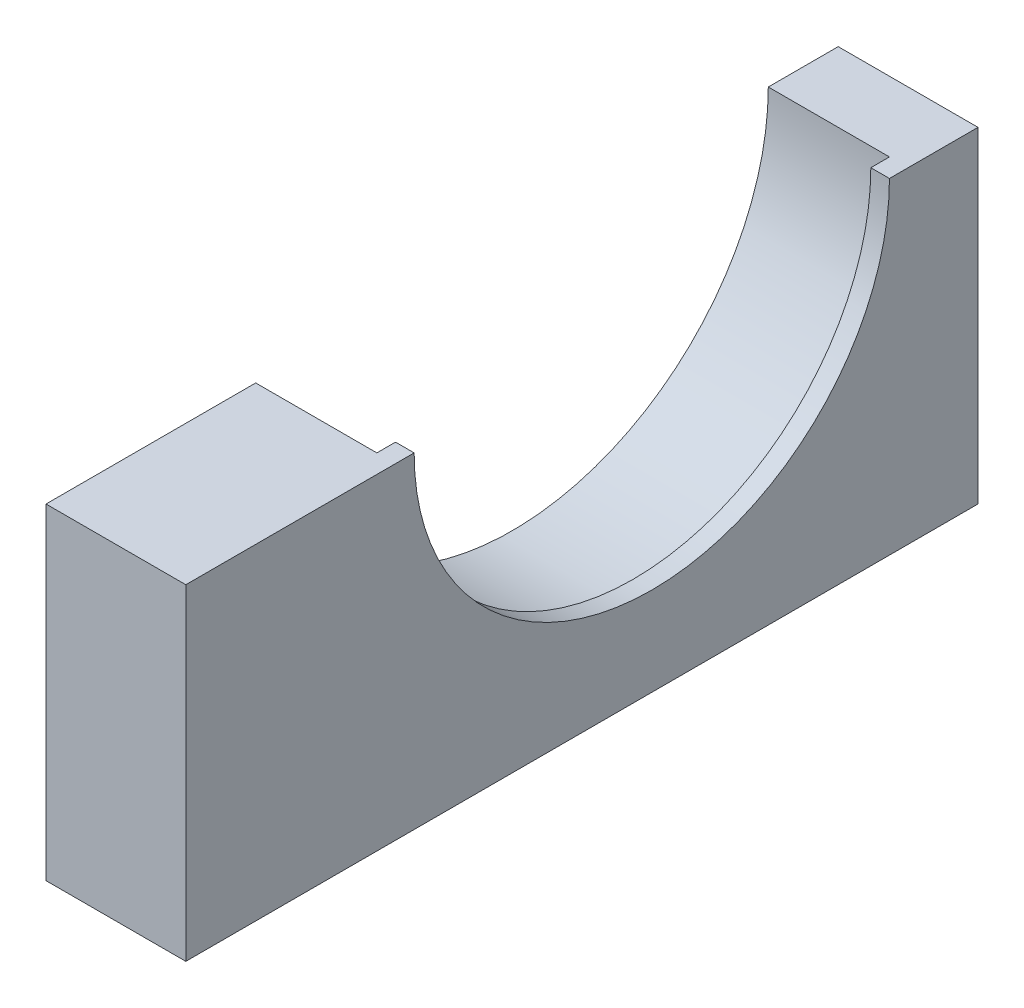
ISO-10303-21;
HEADER;
FILE_DESCRIPTION(('STEP AP214'),'2;1');
FILE_NAME('part.step','',(''),(''),'','','');
FILE_SCHEMA(('AUTOMOTIVE_DESIGN { 1 0 10303 214 1 1 1 1 }'));
ENDSEC;
DATA;
#1=APPLICATION_CONTEXT('core data for automotive mechanical design processes');
#2=APPLICATION_PROTOCOL_DEFINITION('international standard','automotive_design',2000,#1);
#3=PRODUCT_CONTEXT('',#1,'mechanical');
#4=PRODUCT('Part','Part','',(#3));
#5=PRODUCT_RELATED_PRODUCT_CATEGORY('part','',(#4));
#6=PRODUCT_DEFINITION_FORMATION('','',#4);
#7=PRODUCT_DEFINITION_CONTEXT('part definition',#1,'design');
#8=PRODUCT_DEFINITION('design','',#6,#7);
#9=PRODUCT_DEFINITION_SHAPE('','',#8);
#10=(LENGTH_UNIT() NAMED_UNIT(*) SI_UNIT(.MILLI.,.METRE.));
#11=(NAMED_UNIT(*) PLANE_ANGLE_UNIT() SI_UNIT($,.RADIAN.));
#12=(NAMED_UNIT(*) SI_UNIT($,.STERADIAN.) SOLID_ANGLE_UNIT());
#13=UNCERTAINTY_MEASURE_WITH_UNIT(LENGTH_MEASURE(1.E-05),#10,'distance_accuracy_value','');
#14=(GEOMETRIC_REPRESENTATION_CONTEXT(3) GLOBAL_UNCERTAINTY_ASSIGNED_CONTEXT((#13)) GLOBAL_UNIT_ASSIGNED_CONTEXT((#10,
#11,#12)) REPRESENTATION_CONTEXT('',''));
#15=CARTESIAN_POINT('',(0.,0.,0.));
#16=DIRECTION('',(0.,0.,1.));
#17=DIRECTION('',(1.,0.,0.));
#18=AXIS2_PLACEMENT_3D('',#15,#16,#17);
#19=CARTESIAN_POINT('',(13.,0.,50.));
#20=DIRECTION('',(0.,0.,-1.));
#21=DIRECTION('',(0.,1.,0.));
#22=AXIS2_PLACEMENT_3D('',#19,#20,#21);
#23=PLANE('',#22);
#24=DIRECTION('',(0.,-1.,0.));
#25=VECTOR('',#24,1.);
#26=CARTESIAN_POINT('',(0.,0.,50.));
#27=LINE('',#26,#25);
#28=CARTESIAN_POINT('',(0.,0.,50.));
#29=VERTEX_POINT('',#28);
#30=CARTESIAN_POINT('',(0.,-35.,50.));
#31=VERTEX_POINT('',#30);
#32=EDGE_CURVE('E108',#29,#31,#27,.T.);
#33=ORIENTED_EDGE('',*,*,#32,.T.);
#34=DIRECTION('',(-1.,0.,0.));
#35=VECTOR('',#34,1.);
#36=CARTESIAN_POINT('',(13.,-35.,50.));
#37=LINE('',#36,#35);
#38=CARTESIAN_POINT('',(15.,-35.,50.));
#39=VERTEX_POINT('',#38);
#40=EDGE_CURVE('E11',#39,#31,#37,.T.);
#41=ORIENTED_EDGE('',*,*,#40,.F.);
#42=DIRECTION('',(0.,-1.,0.));
#43=VECTOR('',#42,1.);
#44=CARTESIAN_POINT('',(15.,-35.,50.));
#45=LINE('',#44,#43);
#46=CARTESIAN_POINT('',(15.,0.,50.));
#47=VERTEX_POINT('',#46);
#48=EDGE_CURVE('E169',#47,#39,#45,.T.);
#49=ORIENTED_EDGE('',*,*,#48,.F.);
#50=DIRECTION('',(-1.,0.,0.));
#51=VECTOR('',#50,1.);
#52=CARTESIAN_POINT('',(13.,0.,50.));
#53=LINE('',#52,#51);
#54=EDGE_CURVE('E103',#47,#29,#53,.T.);
#55=ORIENTED_EDGE('',*,*,#54,.T.);
#56=EDGE_LOOP('',(#33,#41,#49,#55));
#57=FACE_BOUND('',#56,.T.);
#58=ADVANCED_FACE('F41',(#57),#23,.F.);
#59=CARTESIAN_POINT('',(13.,-35.,50.));
#60=DIRECTION('',(0.,1.,0.));
#61=DIRECTION('',(0.,0.,1.));
#62=AXIS2_PLACEMENT_3D('',#59,#60,#61);
#63=PLANE('',#62);
#64=DIRECTION('',(0.,0.,-1.));
#65=VECTOR('',#64,1.);
#66=CARTESIAN_POINT('',(0.,-35.,50.));
#67=LINE('',#66,#65);
#68=CARTESIAN_POINT('',(0.,-35.,-35.));
#69=VERTEX_POINT('',#68);
#70=EDGE_CURVE('E138',#31,#69,#67,.T.);
#71=ORIENTED_EDGE('',*,*,#70,.T.);
#72=DIRECTION('',(-1.,0.,0.));
#73=VECTOR('',#72,1.);
#74=CARTESIAN_POINT('',(13.,-35.,-35.));
#75=LINE('',#74,#73);
#76=CARTESIAN_POINT('',(15.,-35.,-35.));
#77=VERTEX_POINT('',#76);
#78=EDGE_CURVE('E50',#77,#69,#75,.T.);
#79=ORIENTED_EDGE('',*,*,#78,.F.);
#80=DIRECTION('',(0.,0.,-1.));
#81=VECTOR('',#80,1.);
#82=CARTESIAN_POINT('',(15.,-35.,-35.));
#83=LINE('',#82,#81);
#84=EDGE_CURVE('E166',#39,#77,#83,.T.);
#85=ORIENTED_EDGE('',*,*,#84,.F.);
#86=ORIENTED_EDGE('',*,*,#40,.T.);
#87=EDGE_LOOP('',(#71,#79,#85,#86));
#88=FACE_BOUND('',#87,.T.);
#89=ADVANCED_FACE('F212',(#88),#63,.F.);
#90=CARTESIAN_POINT('',(13.,0.,-35.));
#91=DIRECTION('',(0.,0.,1.));
#92=DIRECTION('',(1.,0.,0.));
#93=AXIS2_PLACEMENT_3D('',#90,#91,#92);
#94=PLANE('',#93);
#95=DIRECTION('',(0.,1.,0.));
#96=VECTOR('',#95,1.);
#97=CARTESIAN_POINT('',(0.,0.,-35.));
#98=LINE('',#97,#96);
#99=CARTESIAN_POINT('',(0.,0.,-35.));
#100=VERTEX_POINT('',#99);
#101=EDGE_CURVE('E131',#69,#100,#98,.T.);
#102=ORIENTED_EDGE('',*,*,#101,.T.);
#103=DIRECTION('',(-1.,0.,0.));
#104=VECTOR('',#103,1.);
#105=CARTESIAN_POINT('',(13.,0.,-35.));
#106=LINE('',#105,#104);
#107=CARTESIAN_POINT('',(15.,0.,-35.));
#108=VERTEX_POINT('',#107);
#109=EDGE_CURVE('E120',#108,#100,#106,.T.);
#110=ORIENTED_EDGE('',*,*,#109,.F.);
#111=DIRECTION('',(0.,1.,0.));
#112=VECTOR('',#111,1.);
#113=CARTESIAN_POINT('',(15.,0.,-35.));
#114=LINE('',#113,#112);
#115=EDGE_CURVE('E134',#77,#108,#114,.T.);
#116=ORIENTED_EDGE('',*,*,#115,.F.);
#117=ORIENTED_EDGE('',*,*,#78,.T.);
#118=EDGE_LOOP('',(#102,#110,#116,#117));
#119=FACE_BOUND('',#118,.T.);
#120=ADVANCED_FACE('F129',(#119),#94,.F.);
#121=CARTESIAN_POINT('',(13.,0.,-27.5));
#122=DIRECTION('',(0.,-1.,0.));
#123=DIRECTION('',(0.,0.,-1.));
#124=AXIS2_PLACEMENT_3D('',#121,#122,#123);
#125=PLANE('',#124);
#126=DIRECTION('',(0.,0.,1.));
#127=VECTOR('',#126,1.);
#128=CARTESIAN_POINT('',(0.,0.,-27.5));
#129=LINE('',#128,#127);
#130=CARTESIAN_POINT('',(0.,0.,-27.5));
#131=VERTEX_POINT('',#130);
#132=EDGE_CURVE('E92',#100,#131,#129,.T.);
#133=ORIENTED_EDGE('',*,*,#132,.T.);
#134=DIRECTION('',(-1.,0.,0.));
#135=VECTOR('',#134,1.);
#136=CARTESIAN_POINT('',(13.,0.,-27.5));
#137=LINE('',#136,#135);
#138=CARTESIAN_POINT('',(13.,0.,-27.5));
#139=VERTEX_POINT('',#138);
#140=EDGE_CURVE('E57',#139,#131,#137,.T.);
#141=ORIENTED_EDGE('',*,*,#140,.F.);
#142=DIRECTION('',(0.,0.,1.));
#143=VECTOR('',#142,1.);
#144=CARTESIAN_POINT('',(13.,0.,-35.));
#145=LINE('',#144,#143);
#146=CARTESIAN_POINT('',(13.,0.,-25.5));
#147=VERTEX_POINT('',#146);
#148=EDGE_CURVE('E161',#139,#147,#145,.T.);
#149=ORIENTED_EDGE('',*,*,#148,.T.);
#150=DIRECTION('',(-1.,0.,0.));
#151=VECTOR('',#150,1.);
#152=CARTESIAN_POINT('',(15.,0.,-25.5));
#153=LINE('',#152,#151);
#154=CARTESIAN_POINT('',(15.,0.,-25.5));
#155=VERTEX_POINT('',#154);
#156=EDGE_CURVE('E146',#155,#147,#153,.T.);
#157=ORIENTED_EDGE('',*,*,#156,.F.);
#158=DIRECTION('',(0.,0.,1.));
#159=VECTOR('',#158,1.);
#160=CARTESIAN_POINT('',(15.,0.,-35.));
#161=LINE('',#160,#159);
#162=EDGE_CURVE('E156',#108,#155,#161,.T.);
#163=ORIENTED_EDGE('',*,*,#162,.F.);
#164=ORIENTED_EDGE('',*,*,#109,.T.);
#165=EDGE_LOOP('',(#133,#141,#149,#157,#163,#164));
#166=FACE_BOUND('',#165,.T.);
#167=ADVANCED_FACE('F194',(#166),#125,.F.);
#168=CARTESIAN_POINT('',(13.,0.,0.));
#169=DIRECTION('',(-1.,0.,0.));
#170=DIRECTION('',(0.,0.,1.));
#171=AXIS2_PLACEMENT_3D('',#168,#169,#170);
#172=CYLINDRICAL_SURFACE('',#171,27.5);
#173=CARTESIAN_POINT('',(0.,0.,0.));
#174=DIRECTION('',(-1.,0.,0.));
#175=DIRECTION('',(0.,0.,-1.));
#176=AXIS2_PLACEMENT_3D('',#173,#174,#175);
#177=CIRCLE('',#176,27.5);
#178=CARTESIAN_POINT('',(0.,0.,27.5));
#179=VERTEX_POINT('',#178);
#180=EDGE_CURVE('E82',#131,#179,#177,.T.);
#181=ORIENTED_EDGE('',*,*,#180,.T.);
#182=DIRECTION('',(-1.,0.,0.));
#183=VECTOR('',#182,1.);
#184=CARTESIAN_POINT('',(13.,0.,27.5));
#185=LINE('',#184,#183);
#186=CARTESIAN_POINT('',(13.,0.,27.5));
#187=VERTEX_POINT('',#186);
#188=EDGE_CURVE('E85',#187,#179,#185,.T.);
#189=ORIENTED_EDGE('',*,*,#188,.F.);
#190=CARTESIAN_POINT('',(13.,0.,0.));
#191=DIRECTION('',(-1.,0.,0.));
#192=DIRECTION('',(0.,0.,-1.));
#193=AXIS2_PLACEMENT_3D('',#190,#191,#192);
#194=CIRCLE('',#193,27.5);
#195=EDGE_CURVE('E110',#139,#187,#194,.T.);
#196=ORIENTED_EDGE('',*,*,#195,.F.);
#197=ORIENTED_EDGE('',*,*,#140,.T.);
#198=EDGE_LOOP('',(#181,#189,#196,#197));
#199=FACE_BOUND('',#198,.T.);
#200=ADVANCED_FACE('F84',(#199),#172,.F.);
#201=CARTESIAN_POINT('',(13.,0.,50.));
#202=DIRECTION('',(0.,-1.,0.));
#203=DIRECTION('',(0.,0.,-1.));
#204=AXIS2_PLACEMENT_3D('',#201,#202,#203);
#205=PLANE('',#204);
#206=DIRECTION('',(0.,0.,1.));
#207=VECTOR('',#206,1.);
#208=CARTESIAN_POINT('',(0.,0.,50.));
#209=LINE('',#208,#207);
#210=EDGE_CURVE('E91',#179,#29,#209,.T.);
#211=ORIENTED_EDGE('',*,*,#210,.T.);
#212=ORIENTED_EDGE('',*,*,#54,.F.);
#213=DIRECTION('',(0.,0.,1.));
#214=VECTOR('',#213,1.);
#215=CARTESIAN_POINT('',(15.,0.,50.));
#216=LINE('',#215,#214);
#217=CARTESIAN_POINT('',(15.,0.,25.5));
#218=VERTEX_POINT('',#217);
#219=EDGE_CURVE('E173',#218,#47,#216,.T.);
#220=ORIENTED_EDGE('',*,*,#219,.F.);
#221=DIRECTION('',(-1.,0.,0.));
#222=VECTOR('',#221,1.);
#223=CARTESIAN_POINT('',(15.,0.,25.5));
#224=LINE('',#223,#222);
#225=CARTESIAN_POINT('',(13.,0.,25.5));
#226=VERTEX_POINT('',#225);
#227=EDGE_CURVE('E151',#218,#226,#224,.T.);
#228=ORIENTED_EDGE('',*,*,#227,.T.);
#229=DIRECTION('',(0.,0.,1.));
#230=VECTOR('',#229,1.);
#231=CARTESIAN_POINT('',(13.,0.,50.));
#232=LINE('',#231,#230);
#233=EDGE_CURVE('E101',#226,#187,#232,.T.);
#234=ORIENTED_EDGE('',*,*,#233,.T.);
#235=ORIENTED_EDGE('',*,*,#188,.T.);
#236=EDGE_LOOP('',(#211,#212,#220,#228,#234,#235));
#237=FACE_BOUND('',#236,.T.);
#238=ADVANCED_FACE('F96',(#237),#205,.F.);
#239=CARTESIAN_POINT('',(0.,0.,0.));
#240=DIRECTION('',(1.,0.,0.));
#241=DIRECTION('',(0.,0.,-1.));
#242=AXIS2_PLACEMENT_3D('',#239,#240,#241);
#243=PLANE('',#242);
#244=ORIENTED_EDGE('',*,*,#32,.F.);
#245=ORIENTED_EDGE('',*,*,#210,.F.);
#246=ORIENTED_EDGE('',*,*,#180,.F.);
#247=ORIENTED_EDGE('',*,*,#132,.F.);
#248=ORIENTED_EDGE('',*,*,#101,.F.);
#249=ORIENTED_EDGE('',*,*,#70,.F.);
#250=EDGE_LOOP('',(#244,#245,#246,#247,#248,#249));
#251=FACE_BOUND('',#250,.T.);
#252=ADVANCED_FACE('F106',(#251),#243,.F.);
#253=CARTESIAN_POINT('',(13.,0.,0.));
#254=DIRECTION('',(1.,0.,0.));
#255=DIRECTION('',(0.,0.,-1.));
#256=AXIS2_PLACEMENT_3D('',#253,#254,#255);
#257=PLANE('',#256);
#258=ORIENTED_EDGE('',*,*,#148,.F.);
#259=ORIENTED_EDGE('',*,*,#195,.T.);
#260=ORIENTED_EDGE('',*,*,#233,.F.);
#261=CARTESIAN_POINT('',(13.,0.,0.));
#262=DIRECTION('',(-1.,0.,0.));
#263=DIRECTION('',(0.,0.,-1.));
#264=AXIS2_PLACEMENT_3D('',#261,#262,#263);
#265=CIRCLE('',#264,25.5);
#266=EDGE_CURVE('E157',#147,#226,#265,.T.);
#267=ORIENTED_EDGE('',*,*,#266,.F.);
#268=EDGE_LOOP('',(#258,#259,#260,#267));
#269=FACE_BOUND('',#268,.T.);
#270=ADVANCED_FACE('F228',(#269),#257,.F.);
#271=CARTESIAN_POINT('',(15.,0.,0.));
#272=DIRECTION('',(-1.,0.,0.));
#273=DIRECTION('',(0.,0.,1.));
#274=AXIS2_PLACEMENT_3D('',#271,#272,#273);
#275=CYLINDRICAL_SURFACE('',#274,25.5);
#276=ORIENTED_EDGE('',*,*,#266,.T.);
#277=ORIENTED_EDGE('',*,*,#227,.F.);
#278=CARTESIAN_POINT('',(15.,0.,0.));
#279=DIRECTION('',(-1.,0.,0.));
#280=DIRECTION('',(0.,0.,-1.));
#281=AXIS2_PLACEMENT_3D('',#278,#279,#280);
#282=CIRCLE('',#281,25.5);
#283=EDGE_CURVE('E177',#155,#218,#282,.T.);
#284=ORIENTED_EDGE('',*,*,#283,.F.);
#285=ORIENTED_EDGE('',*,*,#156,.T.);
#286=EDGE_LOOP('',(#276,#277,#284,#285));
#287=FACE_BOUND('',#286,.T.);
#288=ADVANCED_FACE('F199',(#287),#275,.F.);
#289=CARTESIAN_POINT('',(15.,0.,0.));
#290=DIRECTION('',(1.,0.,0.));
#291=DIRECTION('',(0.,0.,-1.));
#292=AXIS2_PLACEMENT_3D('',#289,#290,#291);
#293=PLANE('',#292);
#294=ORIENTED_EDGE('',*,*,#162,.T.);
#295=ORIENTED_EDGE('',*,*,#283,.T.);
#296=ORIENTED_EDGE('',*,*,#219,.T.);
#297=ORIENTED_EDGE('',*,*,#48,.T.);
#298=ORIENTED_EDGE('',*,*,#84,.T.);
#299=ORIENTED_EDGE('',*,*,#115,.T.);
#300=EDGE_LOOP('',(#294,#295,#296,#297,#298,#299));
#301=FACE_BOUND('',#300,.T.);
#302=ADVANCED_FACE('F187',(#301),#293,.T.);
#303=CLOSED_SHELL('',(#58,#89,#120,#167,#200,#238,#252,#270,#288,#302));
#304=MANIFOLD_SOLID_BREP('B2',#303);
#305=ADVANCED_BREP_SHAPE_REPRESENTATION('',(#18,#304),#14);
#306=SHAPE_DEFINITION_REPRESENTATION(#9,#305);
ENDSEC;
END-ISO-10303-21;
